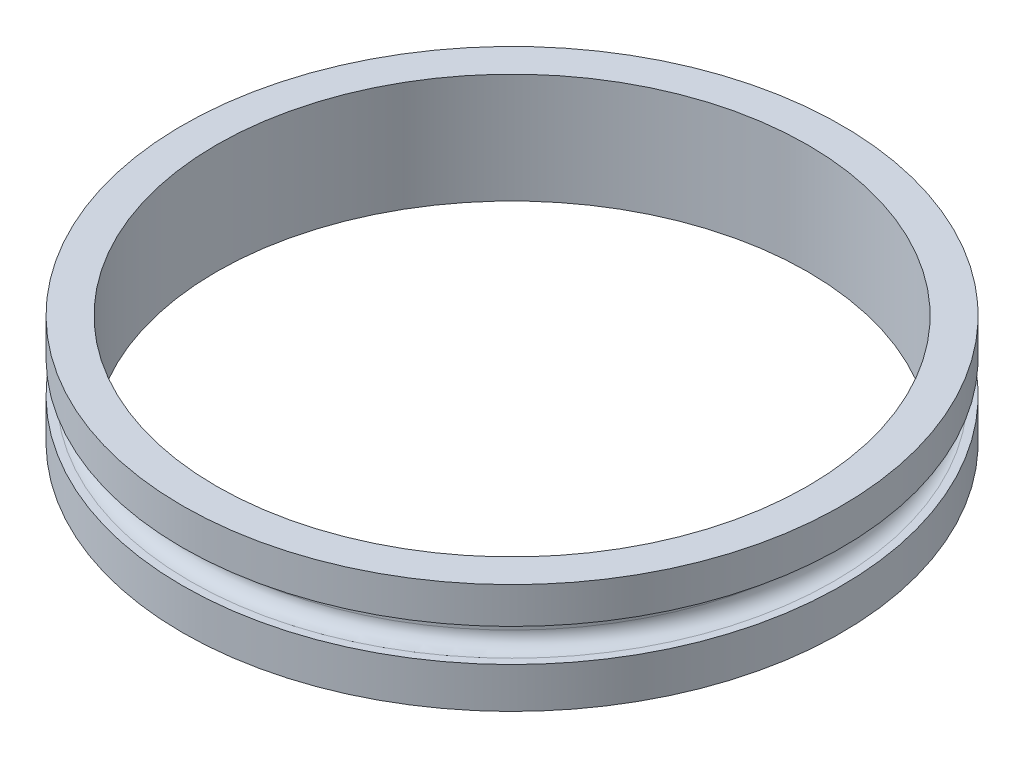
ISO-10303-21;
HEADER;
FILE_DESCRIPTION(('STEP AP214'),'2;1');
FILE_NAME('part.step','',(''),(''),'','','');
FILE_SCHEMA(('AUTOMOTIVE_DESIGN { 1 0 10303 214 1 1 1 1 }'));
ENDSEC;
DATA;
#1=APPLICATION_CONTEXT('core data for automotive mechanical design processes');
#2=APPLICATION_PROTOCOL_DEFINITION('international standard','automotive_design',2000,#1);
#3=PRODUCT_CONTEXT('',#1,'mechanical');
#4=PRODUCT('Part','Part','',(#3));
#5=PRODUCT_RELATED_PRODUCT_CATEGORY('part','',(#4));
#6=PRODUCT_DEFINITION_FORMATION('','',#4);
#7=PRODUCT_DEFINITION_CONTEXT('part definition',#1,'design');
#8=PRODUCT_DEFINITION('design','',#6,#7);
#9=PRODUCT_DEFINITION_SHAPE('','',#8);
#10=(LENGTH_UNIT() NAMED_UNIT(*) SI_UNIT(.MILLI.,.METRE.));
#11=(NAMED_UNIT(*) PLANE_ANGLE_UNIT() SI_UNIT($,.RADIAN.));
#12=(NAMED_UNIT(*) SI_UNIT($,.STERADIAN.) SOLID_ANGLE_UNIT());
#13=UNCERTAINTY_MEASURE_WITH_UNIT(LENGTH_MEASURE(1.E-05),#10,'distance_accuracy_value','');
#14=(GEOMETRIC_REPRESENTATION_CONTEXT(3) GLOBAL_UNCERTAINTY_ASSIGNED_CONTEXT((#13)) GLOBAL_UNIT_ASSIGNED_CONTEXT((#10,
#11,#12)) REPRESENTATION_CONTEXT('',''));
#15=CARTESIAN_POINT('',(0.,0.,0.));
#16=DIRECTION('',(0.,0.,1.));
#17=DIRECTION('',(1.,0.,0.));
#18=AXIS2_PLACEMENT_3D('',#15,#16,#17);
#19=CARTESIAN_POINT('',(38.1,0.,0.));
#20=DIRECTION('',(0.,1.,0.));
#21=DIRECTION('',(0.,0.,1.));
#22=AXIS2_PLACEMENT_3D('',#19,#20,#21);
#23=PLANE('',#22);
#24=CARTESIAN_POINT('',(0.,0.,0.));
#25=DIRECTION('',(0.,1.,0.));
#26=DIRECTION('',(0.,0.,1.));
#27=AXIS2_PLACEMENT_3D('',#24,#25,#26);
#28=CIRCLE('',#27,38.1);
#29=CARTESIAN_POINT('',(0.,0.,38.1));
#30=VERTEX_POINT('',#29);
#31=EDGE_CURVE('E72',#30,#30,#28,.T.);
#32=ORIENTED_EDGE('',*,*,#31,.F.);
#33=EDGE_LOOP('',(#32));
#34=FACE_BOUND('',#33,.T.);
#35=CARTESIAN_POINT('',(0.,0.,0.));
#36=DIRECTION('',(0.,1.,0.));
#37=DIRECTION('',(0.,0.,1.));
#38=AXIS2_PLACEMENT_3D('',#35,#36,#37);
#39=CIRCLE('',#38,34.1757);
#40=CARTESIAN_POINT('',(0.,0.,34.1757));
#41=VERTEX_POINT('',#40);
#42=EDGE_CURVE('E57',#41,#41,#39,.T.);
#43=ORIENTED_EDGE('',*,*,#42,.T.);
#44=EDGE_LOOP('',(#43));
#45=FACE_BOUND('',#44,.T.);
#46=ADVANCED_FACE('F37',(#34,#45),#23,.F.);
#47=CARTESIAN_POINT('',(0.,13.335,0.));
#48=DIRECTION('',(0.,1.,0.));
#49=DIRECTION('',(0.,0.,1.));
#50=AXIS2_PLACEMENT_3D('',#47,#48,#49);
#51=CYLINDRICAL_SURFACE('',#50,34.1757);
#52=ORIENTED_EDGE('',*,*,#42,.F.);
#53=EDGE_LOOP('',(#52));
#54=FACE_BOUND('',#53,.T.);
#55=CARTESIAN_POINT('',(0.,12.7,0.));
#56=DIRECTION('',(0.,1.,0.));
#57=DIRECTION('',(0.,0.,1.));
#58=AXIS2_PLACEMENT_3D('',#55,#56,#57);
#59=CIRCLE('',#58,34.1757);
#60=CARTESIAN_POINT('',(0.,12.7,34.1757));
#61=VERTEX_POINT('',#60);
#62=EDGE_CURVE('E60',#61,#61,#59,.T.);
#63=ORIENTED_EDGE('',*,*,#62,.T.);
#64=EDGE_LOOP('',(#63));
#65=FACE_BOUND('',#64,.T.);
#66=ADVANCED_FACE('F80',(#54,#65),#51,.F.);
#67=CARTESIAN_POINT('',(34.1757,12.7,0.));
#68=DIRECTION('',(0.,-1.,0.));
#69=DIRECTION('',(0.,0.,-1.));
#70=AXIS2_PLACEMENT_3D('',#67,#68,#69);
#71=PLANE('',#70);
#72=ORIENTED_EDGE('',*,*,#62,.F.);
#73=EDGE_LOOP('',(#72));
#74=FACE_BOUND('',#73,.T.);
#75=CARTESIAN_POINT('',(0.,12.7,0.));
#76=DIRECTION('',(0.,1.,0.));
#77=DIRECTION('',(0.,0.,1.));
#78=AXIS2_PLACEMENT_3D('',#75,#76,#77);
#79=CIRCLE('',#78,38.1);
#80=CARTESIAN_POINT('',(0.,12.7,38.1));
#81=VERTEX_POINT('',#80);
#82=EDGE_CURVE('E63',#81,#81,#79,.T.);
#83=ORIENTED_EDGE('',*,*,#82,.T.);
#84=EDGE_LOOP('',(#83));
#85=FACE_BOUND('',#84,.T.);
#86=ADVANCED_FACE('F86',(#74,#85),#71,.F.);
#87=CARTESIAN_POINT('',(0.,13.335,0.));
#88=DIRECTION('',(0.,1.,0.));
#89=DIRECTION('',(0.,0.,1.));
#90=AXIS2_PLACEMENT_3D('',#87,#88,#89);
#91=CYLINDRICAL_SURFACE('',#90,38.1);
#92=ORIENTED_EDGE('',*,*,#82,.F.);
#93=EDGE_LOOP('',(#92));
#94=FACE_BOUND('',#93,.T.);
#95=CARTESIAN_POINT('',(0.,8.509,0.));
#96=DIRECTION('',(0.,1.,0.));
#97=DIRECTION('',(0.,0.,1.));
#98=AXIS2_PLACEMENT_3D('',#95,#96,#97);
#99=CIRCLE('',#98,38.1);
#100=CARTESIAN_POINT('',(0.,8.509,38.1));
#101=VERTEX_POINT('',#100);
#102=EDGE_CURVE('E66',#101,#101,#99,.T.);
#103=ORIENTED_EDGE('',*,*,#102,.T.);
#104=EDGE_LOOP('',(#103));
#105=FACE_BOUND('',#104,.T.);
#106=ADVANCED_FACE('F92',(#94,#105),#91,.T.);
#107=CARTESIAN_POINT('',(38.1,8.509,0.));
#108=DIRECTION('',(0.,1.,0.));
#109=DIRECTION('',(0.,0.,1.));
#110=AXIS2_PLACEMENT_3D('',#107,#108,#109);
#111=PLANE('',#110);
#112=CARTESIAN_POINT('',(0.,8.509,0.));
#113=DIRECTION('',(0.,1.,0.));
#114=DIRECTION('',(0.,0.,1.));
#115=AXIS2_PLACEMENT_3D('',#112,#113,#114);
#116=CIRCLE('',#115,37.211);
#117=CARTESIAN_POINT('',(0.,8.509,37.211));
#118=VERTEX_POINT('',#117);
#119=EDGE_CURVE('E10',#118,#118,#116,.T.);
#120=ORIENTED_EDGE('',*,*,#119,.T.);
#121=EDGE_LOOP('',(#120));
#122=FACE_BOUND('',#121,.T.);
#123=ORIENTED_EDGE('',*,*,#102,.F.);
#124=EDGE_LOOP('',(#123));
#125=FACE_BOUND('',#124,.T.);
#126=ADVANCED_FACE('F98',(#122,#125),#111,.F.);
#127=CARTESIAN_POINT('',(0.,13.335,0.));
#128=DIRECTION('',(0.,1.,0.));
#129=DIRECTION('',(0.,0.,1.));
#130=AXIS2_PLACEMENT_3D('',#127,#128,#129);
#131=CYLINDRICAL_SURFACE('',#130,35.56);
#132=CARTESIAN_POINT('',(0.,6.35,0.));
#133=DIRECTION('',(0.,-1.,0.));
#134=DIRECTION('',(0.,0.,-1.));
#135=AXIS2_PLACEMENT_3D('',#132,#133,#134);
#136=CIRCLE('',#135,35.56);
#137=CARTESIAN_POINT('',(0.,6.35,-35.56));
#138=VERTEX_POINT('',#137);
#139=EDGE_CURVE('E48',#138,#138,#136,.F.);
#140=ORIENTED_EDGE('',*,*,#139,.T.);
#141=EDGE_LOOP('',(#140));
#142=FACE_BOUND('',#141,.T.);
#143=CARTESIAN_POINT('',(0.,6.858,0.));
#144=DIRECTION('',(0.,1.,0.));
#145=DIRECTION('',(0.,0.,1.));
#146=AXIS2_PLACEMENT_3D('',#143,#144,#145);
#147=CIRCLE('',#146,35.56);
#148=CARTESIAN_POINT('',(0.,6.858,35.56));
#149=VERTEX_POINT('',#148);
#150=EDGE_CURVE('E52',#149,#149,#147,.F.);
#151=ORIENTED_EDGE('',*,*,#150,.T.);
#152=EDGE_LOOP('',(#151));
#153=FACE_BOUND('',#152,.T.);
#154=ADVANCED_FACE('F103',(#142,#153),#131,.T.);
#155=CARTESIAN_POINT('',(35.56,4.699,0.));
#156=DIRECTION('',(0.,-1.,0.));
#157=DIRECTION('',(0.,0.,-1.));
#158=AXIS2_PLACEMENT_3D('',#155,#156,#157);
#159=PLANE('',#158);
#160=CARTESIAN_POINT('',(0.,4.699,0.));
#161=DIRECTION('',(0.,-1.,0.));
#162=DIRECTION('',(0.,0.,-1.));
#163=AXIS2_PLACEMENT_3D('',#160,#161,#162);
#164=CIRCLE('',#163,37.211);
#165=CARTESIAN_POINT('',(0.,4.699,-37.211));
#166=VERTEX_POINT('',#165);
#167=EDGE_CURVE('E44',#166,#166,#164,.T.);
#168=ORIENTED_EDGE('',*,*,#167,.T.);
#169=EDGE_LOOP('',(#168));
#170=FACE_BOUND('',#169,.T.);
#171=CARTESIAN_POINT('',(0.,4.699,0.));
#172=DIRECTION('',(0.,1.,0.));
#173=DIRECTION('',(0.,0.,1.));
#174=AXIS2_PLACEMENT_3D('',#171,#172,#173);
#175=CIRCLE('',#174,38.1);
#176=CARTESIAN_POINT('',(0.,4.699,38.1));
#177=VERTEX_POINT('',#176);
#178=EDGE_CURVE('E69',#177,#177,#175,.T.);
#179=ORIENTED_EDGE('',*,*,#178,.T.);
#180=EDGE_LOOP('',(#179));
#181=FACE_BOUND('',#180,.T.);
#182=ADVANCED_FACE('F108',(#170,#181),#159,.F.);
#183=CARTESIAN_POINT('',(0.,13.335,0.));
#184=DIRECTION('',(0.,1.,0.));
#185=DIRECTION('',(0.,0.,1.));
#186=AXIS2_PLACEMENT_3D('',#183,#184,#185);
#187=CYLINDRICAL_SURFACE('',#186,38.1);
#188=ORIENTED_EDGE('',*,*,#178,.F.);
#189=EDGE_LOOP('',(#188));
#190=FACE_BOUND('',#189,.T.);
#191=ORIENTED_EDGE('',*,*,#31,.T.);
#192=EDGE_LOOP('',(#191));
#193=FACE_BOUND('',#192,.T.);
#194=ADVANCED_FACE('F76',(#190,#193),#187,.T.);
#195=CARTESIAN_POINT('',(0.,6.35,0.));
#196=DIRECTION('',(0.,-1.,0.));
#197=DIRECTION('',(0.,0.,-1.));
#198=AXIS2_PLACEMENT_3D('',#195,#196,#197);
#199=TOROIDAL_SURFACE('',#198,37.211,1.651);
#200=ORIENTED_EDGE('',*,*,#167,.F.);
#201=EDGE_LOOP('',(#200));
#202=FACE_BOUND('',#201,.T.);
#203=ORIENTED_EDGE('',*,*,#139,.F.);
#204=EDGE_LOOP('',(#203));
#205=FACE_BOUND('',#204,.T.);
#206=ADVANCED_FACE('F112',(#202,#205),#199,.F.);
#207=CARTESIAN_POINT('',(0.,6.858,0.));
#208=DIRECTION('',(0.,1.,0.));
#209=DIRECTION('',(0.,0.,1.));
#210=AXIS2_PLACEMENT_3D('',#207,#208,#209);
#211=TOROIDAL_SURFACE('',#210,37.211,1.651);
#212=ORIENTED_EDGE('',*,*,#150,.F.);
#213=EDGE_LOOP('',(#212));
#214=FACE_BOUND('',#213,.T.);
#215=ORIENTED_EDGE('',*,*,#119,.F.);
#216=EDGE_LOOP('',(#215));
#217=FACE_BOUND('',#216,.T.);
#218=ADVANCED_FACE('F39',(#214,#217),#211,.F.);
#219=CLOSED_SHELL('',(#46,#66,#86,#106,#126,#154,#182,#194,#206,#218));
#220=MANIFOLD_SOLID_BREP('B2',#219);
#221=ADVANCED_BREP_SHAPE_REPRESENTATION('',(#18,#220),#14);
#222=SHAPE_DEFINITION_REPRESENTATION(#9,#221);
ENDSEC;
END-ISO-10303-21;
